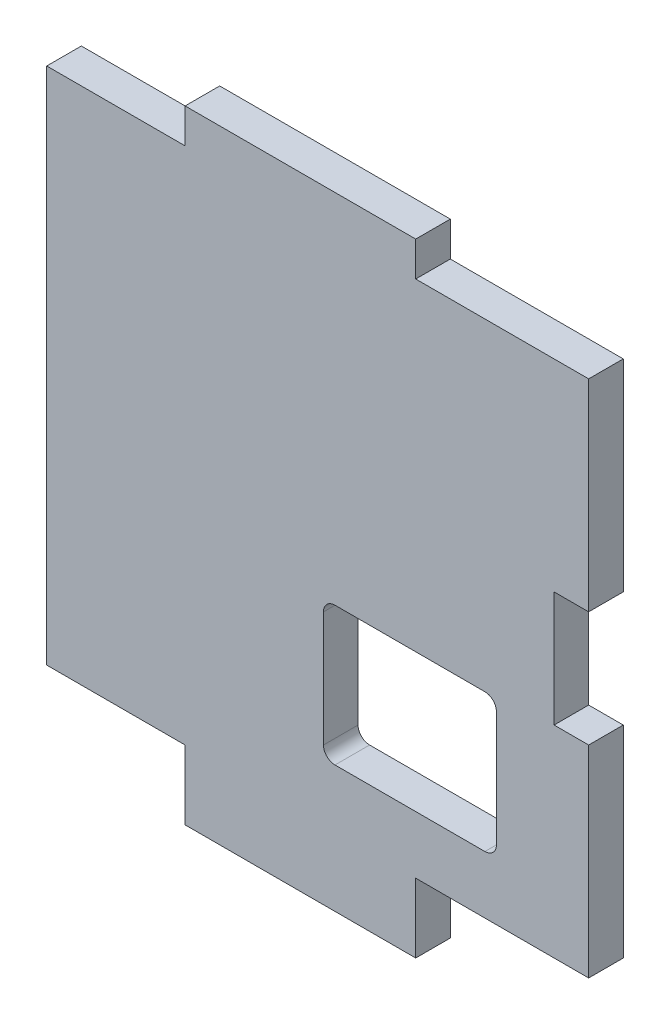
ISO-10303-21;
HEADER;
FILE_DESCRIPTION(('STEP AP214'),'2;1');
FILE_NAME('part.step','',(''),(''),'','','');
FILE_SCHEMA(('AUTOMOTIVE_DESIGN { 1 0 10303 214 1 1 1 1 }'));
ENDSEC;
DATA;
#1=APPLICATION_CONTEXT('core data for automotive mechanical design processes');
#2=APPLICATION_PROTOCOL_DEFINITION('international standard','automotive_design',2000,#1);
#3=PRODUCT_CONTEXT('',#1,'mechanical');
#4=PRODUCT('Part','Part','',(#3));
#5=PRODUCT_RELATED_PRODUCT_CATEGORY('part','',(#4));
#6=PRODUCT_DEFINITION_FORMATION('','',#4);
#7=PRODUCT_DEFINITION_CONTEXT('part definition',#1,'design');
#8=PRODUCT_DEFINITION('design','',#6,#7);
#9=PRODUCT_DEFINITION_SHAPE('','',#8);
#10=(LENGTH_UNIT() NAMED_UNIT(*) SI_UNIT(.MILLI.,.METRE.));
#11=(NAMED_UNIT(*) PLANE_ANGLE_UNIT() SI_UNIT($,.RADIAN.));
#12=(NAMED_UNIT(*) SI_UNIT($,.STERADIAN.) SOLID_ANGLE_UNIT());
#13=UNCERTAINTY_MEASURE_WITH_UNIT(LENGTH_MEASURE(1.E-05),#10,'distance_accuracy_value','');
#14=(GEOMETRIC_REPRESENTATION_CONTEXT(3) GLOBAL_UNCERTAINTY_ASSIGNED_CONTEXT((#13)) GLOBAL_UNIT_ASSIGNED_CONTEXT((#10,
#11,#12)) REPRESENTATION_CONTEXT('',''));
#15=CARTESIAN_POINT('',(0.,0.,0.));
#16=DIRECTION('',(0.,0.,1.));
#17=DIRECTION('',(1.,0.,0.));
#18=AXIS2_PLACEMENT_3D('',#15,#16,#17);
#19=CARTESIAN_POINT('',(12.,0.,3.));
#20=DIRECTION('',(0.,1.,0.));
#21=DIRECTION('',(-1.,0.,0.));
#22=AXIS2_PLACEMENT_3D('',#19,#20,#21);
#23=PLANE('',#22);
#24=DIRECTION('',(1.,0.,0.));
#25=VECTOR('',#24,1.);
#26=CARTESIAN_POINT('',(12.,0.,0.));
#27=LINE('',#26,#25);
#28=CARTESIAN_POINT('',(0.,0.,0.));
#29=VERTEX_POINT('',#28);
#30=CARTESIAN_POINT('',(12.,0.,0.));
#31=VERTEX_POINT('',#30);
#32=EDGE_CURVE('E217',#29,#31,#27,.T.);
#33=ORIENTED_EDGE('',*,*,#32,.T.);
#34=DIRECTION('',(0.,0.,-1.));
#35=VECTOR('',#34,1.);
#36=CARTESIAN_POINT('',(12.,0.,3.));
#37=LINE('',#36,#35);
#38=CARTESIAN_POINT('',(12.,0.,3.));
#39=VERTEX_POINT('',#38);
#40=EDGE_CURVE('E198',#39,#31,#37,.T.);
#41=ORIENTED_EDGE('',*,*,#40,.F.);
#42=DIRECTION('',(1.,0.,0.));
#43=VECTOR('',#42,1.);
#44=CARTESIAN_POINT('',(12.,0.,3.));
#45=LINE('',#44,#43);
#46=CARTESIAN_POINT('',(0.,0.,3.));
#47=VERTEX_POINT('',#46);
#48=EDGE_CURVE('E205',#47,#39,#45,.T.);
#49=ORIENTED_EDGE('',*,*,#48,.F.);
#50=DIRECTION('',(0.,0.,-1.));
#51=VECTOR('',#50,1.);
#52=CARTESIAN_POINT('',(0.,0.,3.));
#53=LINE('',#52,#51);
#54=EDGE_CURVE('E315',#47,#29,#53,.T.);
#55=ORIENTED_EDGE('',*,*,#54,.T.);
#56=EDGE_LOOP('',(#33,#41,#49,#55));
#57=FACE_BOUND('',#56,.T.);
#58=ADVANCED_FACE('F32',(#57),#23,.F.);
#59=CARTESIAN_POINT('',(12.,-6.,3.));
#60=DIRECTION('',(1.,0.,0.));
#61=DIRECTION('',(0.,1.,0.));
#62=AXIS2_PLACEMENT_3D('',#59,#60,#61);
#63=PLANE('',#62);
#64=DIRECTION('',(0.,-1.,0.));
#65=VECTOR('',#64,1.);
#66=CARTESIAN_POINT('',(12.,-6.,0.));
#67=LINE('',#66,#65);
#68=CARTESIAN_POINT('',(12.,-6.,0.));
#69=VERTEX_POINT('',#68);
#70=EDGE_CURVE('E317',#31,#69,#67,.T.);
#71=ORIENTED_EDGE('',*,*,#70,.T.);
#72=DIRECTION('',(0.,0.,-1.));
#73=VECTOR('',#72,1.);
#74=CARTESIAN_POINT('',(12.,-6.,3.));
#75=LINE('',#74,#73);
#76=CARTESIAN_POINT('',(12.,-6.,3.));
#77=VERTEX_POINT('',#76);
#78=EDGE_CURVE('E201',#77,#69,#75,.T.);
#79=ORIENTED_EDGE('',*,*,#78,.F.);
#80=DIRECTION('',(0.,-1.,0.));
#81=VECTOR('',#80,1.);
#82=CARTESIAN_POINT('',(12.,-6.,3.));
#83=LINE('',#82,#81);
#84=EDGE_CURVE('E194',#39,#77,#83,.T.);
#85=ORIENTED_EDGE('',*,*,#84,.F.);
#86=ORIENTED_EDGE('',*,*,#40,.T.);
#87=EDGE_LOOP('',(#71,#79,#85,#86));
#88=FACE_BOUND('',#87,.T.);
#89=ADVANCED_FACE('F196',(#88),#63,.F.);
#90=CARTESIAN_POINT('',(32.,-6.,3.));
#91=DIRECTION('',(0.,1.,0.));
#92=DIRECTION('',(-1.,0.,0.));
#93=AXIS2_PLACEMENT_3D('',#90,#91,#92);
#94=PLANE('',#93);
#95=DIRECTION('',(1.,0.,0.));
#96=VECTOR('',#95,1.);
#97=CARTESIAN_POINT('',(32.,-6.,0.));
#98=LINE('',#97,#96);
#99=CARTESIAN_POINT('',(32.,-6.,0.));
#100=VERTEX_POINT('',#99);
#101=EDGE_CURVE('E319',#69,#100,#98,.T.);
#102=ORIENTED_EDGE('',*,*,#101,.T.);
#103=DIRECTION('',(0.,0.,-1.));
#104=VECTOR('',#103,1.);
#105=CARTESIAN_POINT('',(32.,-6.,3.));
#106=LINE('',#105,#104);
#107=CARTESIAN_POINT('',(32.,-6.,3.));
#108=VERTEX_POINT('',#107);
#109=EDGE_CURVE('E222',#108,#100,#106,.T.);
#110=ORIENTED_EDGE('',*,*,#109,.F.);
#111=DIRECTION('',(1.,0.,0.));
#112=VECTOR('',#111,1.);
#113=CARTESIAN_POINT('',(32.,-6.,3.));
#114=LINE('',#113,#112);
#115=EDGE_CURVE('E204',#77,#108,#114,.T.);
#116=ORIENTED_EDGE('',*,*,#115,.F.);
#117=ORIENTED_EDGE('',*,*,#78,.T.);
#118=EDGE_LOOP('',(#102,#110,#116,#117));
#119=FACE_BOUND('',#118,.T.);
#120=ADVANCED_FACE('F404',(#119),#94,.F.);
#121=CARTESIAN_POINT('',(32.,0.,3.));
#122=DIRECTION('',(-1.,0.,0.));
#123=DIRECTION('',(0.,0.,1.));
#124=AXIS2_PLACEMENT_3D('',#121,#122,#123);
#125=PLANE('',#124);
#126=DIRECTION('',(0.,1.,0.));
#127=VECTOR('',#126,1.);
#128=CARTESIAN_POINT('',(32.,0.,0.));
#129=LINE('',#128,#127);
#130=CARTESIAN_POINT('',(32.,0.,0.));
#131=VERTEX_POINT('',#130);
#132=EDGE_CURVE('E321',#100,#131,#129,.T.);
#133=ORIENTED_EDGE('',*,*,#132,.T.);
#134=DIRECTION('',(0.,0.,-1.));
#135=VECTOR('',#134,1.);
#136=CARTESIAN_POINT('',(32.,0.,3.));
#137=LINE('',#136,#135);
#138=CARTESIAN_POINT('',(32.,0.,3.));
#139=VERTEX_POINT('',#138);
#140=EDGE_CURVE('E380',#139,#131,#137,.T.);
#141=ORIENTED_EDGE('',*,*,#140,.F.);
#142=DIRECTION('',(0.,1.,0.));
#143=VECTOR('',#142,1.);
#144=CARTESIAN_POINT('',(32.,0.,3.));
#145=LINE('',#144,#143);
#146=EDGE_CURVE('E290',#108,#139,#145,.T.);
#147=ORIENTED_EDGE('',*,*,#146,.F.);
#148=ORIENTED_EDGE('',*,*,#109,.T.);
#149=EDGE_LOOP('',(#133,#141,#147,#148));
#150=FACE_BOUND('',#149,.T.);
#151=ADVANCED_FACE('F387',(#150),#125,.F.);
#152=CARTESIAN_POINT('',(47.,0.,3.));
#153=DIRECTION('',(0.,1.,0.));
#154=DIRECTION('',(0.,0.,1.));
#155=AXIS2_PLACEMENT_3D('',#152,#153,#154);
#156=PLANE('',#155);
#157=DIRECTION('',(1.,0.,0.));
#158=VECTOR('',#157,1.);
#159=CARTESIAN_POINT('',(47.,0.,0.));
#160=LINE('',#159,#158);
#161=CARTESIAN_POINT('',(47.,0.,0.));
#162=VERTEX_POINT('',#161);
#163=EDGE_CURVE('E323',#131,#162,#160,.T.);
#164=ORIENTED_EDGE('',*,*,#163,.T.);
#165=DIRECTION('',(0.,0.,-1.));
#166=VECTOR('',#165,1.);
#167=CARTESIAN_POINT('',(47.,0.,3.));
#168=LINE('',#167,#166);
#169=CARTESIAN_POINT('',(47.,0.,3.));
#170=VERTEX_POINT('',#169);
#171=EDGE_CURVE('E377',#170,#162,#168,.T.);
#172=ORIENTED_EDGE('',*,*,#171,.F.);
#173=DIRECTION('',(1.,0.,0.));
#174=VECTOR('',#173,1.);
#175=CARTESIAN_POINT('',(47.,0.,3.));
#176=LINE('',#175,#174);
#177=EDGE_CURVE('E292',#139,#170,#176,.T.);
#178=ORIENTED_EDGE('',*,*,#177,.F.);
#179=ORIENTED_EDGE('',*,*,#140,.T.);
#180=EDGE_LOOP('',(#164,#172,#178,#179));
#181=FACE_BOUND('',#180,.T.);
#182=ADVANCED_FACE('F396',(#181),#156,.F.);
#183=CARTESIAN_POINT('',(47.,17.5,3.));
#184=DIRECTION('',(-1.,0.,0.));
#185=DIRECTION('',(0.,0.,1.));
#186=AXIS2_PLACEMENT_3D('',#183,#184,#185);
#187=PLANE('',#186);
#188=DIRECTION('',(0.,1.,0.));
#189=VECTOR('',#188,1.);
#190=CARTESIAN_POINT('',(47.,17.5,0.));
#191=LINE('',#190,#189);
#192=CARTESIAN_POINT('',(47.,17.5,0.));
#193=VERTEX_POINT('',#192);
#194=EDGE_CURVE('E325',#162,#193,#191,.T.);
#195=ORIENTED_EDGE('',*,*,#194,.T.);
#196=DIRECTION('',(0.,0.,-1.));
#197=VECTOR('',#196,1.);
#198=CARTESIAN_POINT('',(47.,17.5,3.));
#199=LINE('',#198,#197);
#200=CARTESIAN_POINT('',(47.,17.5,3.));
#201=VERTEX_POINT('',#200);
#202=EDGE_CURVE('E374',#201,#193,#199,.T.);
#203=ORIENTED_EDGE('',*,*,#202,.F.);
#204=DIRECTION('',(0.,1.,0.));
#205=VECTOR('',#204,1.);
#206=CARTESIAN_POINT('',(47.,17.5,3.));
#207=LINE('',#206,#205);
#208=EDGE_CURVE('E294',#170,#201,#207,.T.);
#209=ORIENTED_EDGE('',*,*,#208,.F.);
#210=ORIENTED_EDGE('',*,*,#171,.T.);
#211=EDGE_LOOP('',(#195,#203,#209,#210));
#212=FACE_BOUND('',#211,.T.);
#213=ADVANCED_FACE('F400',(#212),#187,.F.);
#214=CARTESIAN_POINT('',(44.,17.5,3.));
#215=DIRECTION('',(0.,-1.,0.));
#216=DIRECTION('',(0.,0.,-1.));
#217=AXIS2_PLACEMENT_3D('',#214,#215,#216);
#218=PLANE('',#217);
#219=DIRECTION('',(-1.,0.,0.));
#220=VECTOR('',#219,1.);
#221=CARTESIAN_POINT('',(44.,17.5,0.));
#222=LINE('',#221,#220);
#223=CARTESIAN_POINT('',(44.,17.5,0.));
#224=VERTEX_POINT('',#223);
#225=EDGE_CURVE('E327',#193,#224,#222,.T.);
#226=ORIENTED_EDGE('',*,*,#225,.T.);
#227=DIRECTION('',(0.,0.,-1.));
#228=VECTOR('',#227,1.);
#229=CARTESIAN_POINT('',(44.,17.5,3.));
#230=LINE('',#229,#228);
#231=CARTESIAN_POINT('',(44.,17.5,3.));
#232=VERTEX_POINT('',#231);
#233=EDGE_CURVE('E371',#232,#224,#230,.T.);
#234=ORIENTED_EDGE('',*,*,#233,.F.);
#235=DIRECTION('',(-1.,0.,0.));
#236=VECTOR('',#235,1.);
#237=CARTESIAN_POINT('',(44.,17.5,3.));
#238=LINE('',#237,#236);
#239=EDGE_CURVE('E296',#201,#232,#238,.T.);
#240=ORIENTED_EDGE('',*,*,#239,.F.);
#241=ORIENTED_EDGE('',*,*,#202,.T.);
#242=EDGE_LOOP('',(#226,#234,#240,#241));
#243=FACE_BOUND('',#242,.T.);
#244=ADVANCED_FACE('F494',(#243),#218,.F.);
#245=CARTESIAN_POINT('',(44.,27.5,3.));
#246=DIRECTION('',(-1.,0.,0.));
#247=DIRECTION('',(0.,0.,1.));
#248=AXIS2_PLACEMENT_3D('',#245,#246,#247);
#249=PLANE('',#248);
#250=DIRECTION('',(0.,1.,0.));
#251=VECTOR('',#250,1.);
#252=CARTESIAN_POINT('',(44.,27.5,0.));
#253=LINE('',#252,#251);
#254=CARTESIAN_POINT('',(44.,27.5,0.));
#255=VERTEX_POINT('',#254);
#256=EDGE_CURVE('E329',#224,#255,#253,.T.);
#257=ORIENTED_EDGE('',*,*,#256,.T.);
#258=DIRECTION('',(0.,0.,-1.));
#259=VECTOR('',#258,1.);
#260=CARTESIAN_POINT('',(44.,27.5,3.));
#261=LINE('',#260,#259);
#262=CARTESIAN_POINT('',(44.,27.5,3.));
#263=VERTEX_POINT('',#262);
#264=EDGE_CURVE('E368',#263,#255,#261,.T.);
#265=ORIENTED_EDGE('',*,*,#264,.F.);
#266=DIRECTION('',(0.,1.,0.));
#267=VECTOR('',#266,1.);
#268=CARTESIAN_POINT('',(44.,27.5,3.));
#269=LINE('',#268,#267);
#270=EDGE_CURVE('E298',#232,#263,#269,.T.);
#271=ORIENTED_EDGE('',*,*,#270,.F.);
#272=ORIENTED_EDGE('',*,*,#233,.T.);
#273=EDGE_LOOP('',(#257,#265,#271,#272));
#274=FACE_BOUND('',#273,.T.);
#275=ADVANCED_FACE('F490',(#274),#249,.F.);
#276=CARTESIAN_POINT('',(47.,27.5,3.));
#277=DIRECTION('',(0.,1.,0.));
#278=DIRECTION('',(-1.,0.,0.));
#279=AXIS2_PLACEMENT_3D('',#276,#277,#278);
#280=PLANE('',#279);
#281=DIRECTION('',(1.,0.,0.));
#282=VECTOR('',#281,1.);
#283=CARTESIAN_POINT('',(47.,27.5,0.));
#284=LINE('',#283,#282);
#285=CARTESIAN_POINT('',(47.,27.5,0.));
#286=VERTEX_POINT('',#285);
#287=EDGE_CURVE('E331',#255,#286,#284,.T.);
#288=ORIENTED_EDGE('',*,*,#287,.T.);
#289=DIRECTION('',(0.,0.,-1.));
#290=VECTOR('',#289,1.);
#291=CARTESIAN_POINT('',(47.,27.5,3.));
#292=LINE('',#291,#290);
#293=CARTESIAN_POINT('',(47.,27.5,3.));
#294=VERTEX_POINT('',#293);
#295=EDGE_CURVE('E365',#294,#286,#292,.T.);
#296=ORIENTED_EDGE('',*,*,#295,.F.);
#297=DIRECTION('',(1.,0.,0.));
#298=VECTOR('',#297,1.);
#299=CARTESIAN_POINT('',(47.,27.5,3.));
#300=LINE('',#299,#298);
#301=EDGE_CURVE('E300',#263,#294,#300,.T.);
#302=ORIENTED_EDGE('',*,*,#301,.F.);
#303=ORIENTED_EDGE('',*,*,#264,.T.);
#304=EDGE_LOOP('',(#288,#296,#302,#303));
#305=FACE_BOUND('',#304,.T.);
#306=ADVANCED_FACE('F486',(#305),#280,.F.);
#307=CARTESIAN_POINT('',(47.,45.,3.));
#308=DIRECTION('',(-1.,0.,0.));
#309=DIRECTION('',(0.,0.,1.));
#310=AXIS2_PLACEMENT_3D('',#307,#308,#309);
#311=PLANE('',#310);
#312=DIRECTION('',(0.,1.,0.));
#313=VECTOR('',#312,1.);
#314=CARTESIAN_POINT('',(47.,45.,0.));
#315=LINE('',#314,#313);
#316=CARTESIAN_POINT('',(47.,45.,0.));
#317=VERTEX_POINT('',#316);
#318=EDGE_CURVE('E333',#286,#317,#315,.T.);
#319=ORIENTED_EDGE('',*,*,#318,.T.);
#320=DIRECTION('',(0.,0.,-1.));
#321=VECTOR('',#320,1.);
#322=CARTESIAN_POINT('',(47.,45.,3.));
#323=LINE('',#322,#321);
#324=CARTESIAN_POINT('',(47.,45.,3.));
#325=VERTEX_POINT('',#324);
#326=EDGE_CURVE('E362',#325,#317,#323,.T.);
#327=ORIENTED_EDGE('',*,*,#326,.F.);
#328=DIRECTION('',(0.,1.,0.));
#329=VECTOR('',#328,1.);
#330=CARTESIAN_POINT('',(47.,45.,3.));
#331=LINE('',#330,#329);
#332=EDGE_CURVE('E302',#294,#325,#331,.T.);
#333=ORIENTED_EDGE('',*,*,#332,.F.);
#334=ORIENTED_EDGE('',*,*,#295,.T.);
#335=EDGE_LOOP('',(#319,#327,#333,#334));
#336=FACE_BOUND('',#335,.T.);
#337=ADVANCED_FACE('F482',(#336),#311,.F.);
#338=CARTESIAN_POINT('',(32.,45.,3.));
#339=DIRECTION('',(0.,-1.,0.));
#340=DIRECTION('',(0.,0.,-1.));
#341=AXIS2_PLACEMENT_3D('',#338,#339,#340);
#342=PLANE('',#341);
#343=DIRECTION('',(-1.,0.,0.));
#344=VECTOR('',#343,1.);
#345=CARTESIAN_POINT('',(32.,45.,0.));
#346=LINE('',#345,#344);
#347=CARTESIAN_POINT('',(32.,45.,0.));
#348=VERTEX_POINT('',#347);
#349=EDGE_CURVE('E335',#317,#348,#346,.T.);
#350=ORIENTED_EDGE('',*,*,#349,.T.);
#351=DIRECTION('',(0.,0.,-1.));
#352=VECTOR('',#351,1.);
#353=CARTESIAN_POINT('',(32.,45.,3.));
#354=LINE('',#353,#352);
#355=CARTESIAN_POINT('',(32.,45.,3.));
#356=VERTEX_POINT('',#355);
#357=EDGE_CURVE('E359',#356,#348,#354,.T.);
#358=ORIENTED_EDGE('',*,*,#357,.F.);
#359=DIRECTION('',(-1.,0.,0.));
#360=VECTOR('',#359,1.);
#361=CARTESIAN_POINT('',(32.,45.,3.));
#362=LINE('',#361,#360);
#363=EDGE_CURVE('E304',#325,#356,#362,.T.);
#364=ORIENTED_EDGE('',*,*,#363,.F.);
#365=ORIENTED_EDGE('',*,*,#326,.T.);
#366=EDGE_LOOP('',(#350,#358,#364,#365));
#367=FACE_BOUND('',#366,.T.);
#368=ADVANCED_FACE('F478',(#367),#342,.F.);
#369=CARTESIAN_POINT('',(32.,48.,3.));
#370=DIRECTION('',(-1.,0.,0.));
#371=DIRECTION('',(0.,0.,1.));
#372=AXIS2_PLACEMENT_3D('',#369,#370,#371);
#373=PLANE('',#372);
#374=DIRECTION('',(0.,1.,0.));
#375=VECTOR('',#374,1.);
#376=CARTESIAN_POINT('',(32.,48.,0.));
#377=LINE('',#376,#375);
#378=CARTESIAN_POINT('',(32.,48.,0.));
#379=VERTEX_POINT('',#378);
#380=EDGE_CURVE('E337',#348,#379,#377,.T.);
#381=ORIENTED_EDGE('',*,*,#380,.T.);
#382=DIRECTION('',(0.,0.,-1.));
#383=VECTOR('',#382,1.);
#384=CARTESIAN_POINT('',(32.,48.,3.));
#385=LINE('',#384,#383);
#386=CARTESIAN_POINT('',(32.,48.,3.));
#387=VERTEX_POINT('',#386);
#388=EDGE_CURVE('E356',#387,#379,#385,.T.);
#389=ORIENTED_EDGE('',*,*,#388,.F.);
#390=DIRECTION('',(0.,1.,0.));
#391=VECTOR('',#390,1.);
#392=CARTESIAN_POINT('',(32.,48.,3.));
#393=LINE('',#392,#391);
#394=EDGE_CURVE('E306',#356,#387,#393,.T.);
#395=ORIENTED_EDGE('',*,*,#394,.F.);
#396=ORIENTED_EDGE('',*,*,#357,.T.);
#397=EDGE_LOOP('',(#381,#389,#395,#396));
#398=FACE_BOUND('',#397,.T.);
#399=ADVANCED_FACE('F474',(#398),#373,.F.);
#400=CARTESIAN_POINT('',(12.,48.,3.));
#401=DIRECTION('',(0.,-1.,0.));
#402=DIRECTION('',(0.,0.,-1.));
#403=AXIS2_PLACEMENT_3D('',#400,#401,#402);
#404=PLANE('',#403);
#405=DIRECTION('',(-1.,0.,0.));
#406=VECTOR('',#405,1.);
#407=CARTESIAN_POINT('',(12.,48.,0.));
#408=LINE('',#407,#406);
#409=CARTESIAN_POINT('',(12.,48.,0.));
#410=VERTEX_POINT('',#409);
#411=EDGE_CURVE('E339',#379,#410,#408,.T.);
#412=ORIENTED_EDGE('',*,*,#411,.T.);
#413=DIRECTION('',(0.,0.,-1.));
#414=VECTOR('',#413,1.);
#415=CARTESIAN_POINT('',(12.,48.,3.));
#416=LINE('',#415,#414);
#417=CARTESIAN_POINT('',(12.,48.,3.));
#418=VERTEX_POINT('',#417);
#419=EDGE_CURVE('E353',#418,#410,#416,.T.);
#420=ORIENTED_EDGE('',*,*,#419,.F.);
#421=DIRECTION('',(-1.,0.,0.));
#422=VECTOR('',#421,1.);
#423=CARTESIAN_POINT('',(12.,48.,3.));
#424=LINE('',#423,#422);
#425=EDGE_CURVE('E308',#387,#418,#424,.T.);
#426=ORIENTED_EDGE('',*,*,#425,.F.);
#427=ORIENTED_EDGE('',*,*,#388,.T.);
#428=EDGE_LOOP('',(#412,#420,#426,#427));
#429=FACE_BOUND('',#428,.T.);
#430=ADVANCED_FACE('F470',(#429),#404,.F.);
#431=CARTESIAN_POINT('',(12.,45.,3.));
#432=DIRECTION('',(1.,0.,0.));
#433=DIRECTION('',(0.,0.,-1.));
#434=AXIS2_PLACEMENT_3D('',#431,#432,#433);
#435=PLANE('',#434);
#436=DIRECTION('',(0.,-1.,0.));
#437=VECTOR('',#436,1.);
#438=CARTESIAN_POINT('',(12.,45.,0.));
#439=LINE('',#438,#437);
#440=CARTESIAN_POINT('',(12.,45.,0.));
#441=VERTEX_POINT('',#440);
#442=EDGE_CURVE('E341',#410,#441,#439,.T.);
#443=ORIENTED_EDGE('',*,*,#442,.T.);
#444=DIRECTION('',(0.,0.,-1.));
#445=VECTOR('',#444,1.);
#446=CARTESIAN_POINT('',(12.,45.,3.));
#447=LINE('',#446,#445);
#448=CARTESIAN_POINT('',(12.,45.,3.));
#449=VERTEX_POINT('',#448);
#450=EDGE_CURVE('E350',#449,#441,#447,.T.);
#451=ORIENTED_EDGE('',*,*,#450,.F.);
#452=DIRECTION('',(0.,-1.,0.));
#453=VECTOR('',#452,1.);
#454=CARTESIAN_POINT('',(12.,45.,3.));
#455=LINE('',#454,#453);
#456=EDGE_CURVE('E310',#418,#449,#455,.T.);
#457=ORIENTED_EDGE('',*,*,#456,.F.);
#458=ORIENTED_EDGE('',*,*,#419,.T.);
#459=EDGE_LOOP('',(#443,#451,#457,#458));
#460=FACE_BOUND('',#459,.T.);
#461=ADVANCED_FACE('F466',(#460),#435,.F.);
#462=CARTESIAN_POINT('',(0.,45.,3.));
#463=DIRECTION('',(0.,-1.,0.));
#464=DIRECTION('',(0.,0.,-1.));
#465=AXIS2_PLACEMENT_3D('',#462,#463,#464);
#466=PLANE('',#465);
#467=DIRECTION('',(-1.,0.,0.));
#468=VECTOR('',#467,1.);
#469=CARTESIAN_POINT('',(0.,45.,0.));
#470=LINE('',#469,#468);
#471=CARTESIAN_POINT('',(0.,45.,0.));
#472=VERTEX_POINT('',#471);
#473=EDGE_CURVE('E343',#441,#472,#470,.T.);
#474=ORIENTED_EDGE('',*,*,#473,.T.);
#475=DIRECTION('',(0.,0.,-1.));
#476=VECTOR('',#475,1.);
#477=CARTESIAN_POINT('',(0.,45.,3.));
#478=LINE('',#477,#476);
#479=CARTESIAN_POINT('',(0.,45.,3.));
#480=VERTEX_POINT('',#479);
#481=EDGE_CURVE('E347',#480,#472,#478,.T.);
#482=ORIENTED_EDGE('',*,*,#481,.F.);
#483=DIRECTION('',(-1.,0.,0.));
#484=VECTOR('',#483,1.);
#485=CARTESIAN_POINT('',(0.,45.,3.));
#486=LINE('',#485,#484);
#487=EDGE_CURVE('E312',#449,#480,#486,.T.);
#488=ORIENTED_EDGE('',*,*,#487,.F.);
#489=ORIENTED_EDGE('',*,*,#450,.T.);
#490=EDGE_LOOP('',(#474,#482,#488,#489));
#491=FACE_BOUND('',#490,.T.);
#492=ADVANCED_FACE('F462',(#491),#466,.F.);
#493=CARTESIAN_POINT('',(0.,0.,3.));
#494=DIRECTION('',(1.,0.,0.));
#495=DIRECTION('',(0.,0.,-1.));
#496=AXIS2_PLACEMENT_3D('',#493,#494,#495);
#497=PLANE('',#496);
#498=DIRECTION('',(0.,-1.,0.));
#499=VECTOR('',#498,1.);
#500=CARTESIAN_POINT('',(0.,0.,0.));
#501=LINE('',#500,#499);
#502=EDGE_CURVE('E214',#472,#29,#501,.T.);
#503=ORIENTED_EDGE('',*,*,#502,.T.);
#504=ORIENTED_EDGE('',*,*,#54,.F.);
#505=DIRECTION('',(0.,-1.,0.));
#506=VECTOR('',#505,1.);
#507=CARTESIAN_POINT('',(0.,0.,3.));
#508=LINE('',#507,#506);
#509=EDGE_CURVE('E210',#480,#47,#508,.T.);
#510=ORIENTED_EDGE('',*,*,#509,.F.);
#511=ORIENTED_EDGE('',*,*,#481,.T.);
#512=EDGE_LOOP('',(#503,#504,#510,#511));
#513=FACE_BOUND('',#512,.T.);
#514=ADVANCED_FACE('F457',(#513),#497,.F.);
#515=CARTESIAN_POINT('',(0.,0.,3.));
#516=DIRECTION('',(0.,0.,-1.));
#517=DIRECTION('',(-1.,0.,0.));
#518=AXIS2_PLACEMENT_3D('',#515,#516,#517);
#519=PLANE('',#518);
#520=DIRECTION('',(1.,0.,0.));
#521=VECTOR('',#520,1.);
#522=CARTESIAN_POINT('',(24.,5.,3.));
#523=LINE('',#522,#521);
#524=CARTESIAN_POINT('',(25.,5.,3.));
#525=VERTEX_POINT('',#524);
#526=CARTESIAN_POINT('',(38.,5.,3.));
#527=VERTEX_POINT('',#526);
#528=EDGE_CURVE('E257',#525,#527,#523,.T.);
#529=ORIENTED_EDGE('',*,*,#528,.F.);
#530=CARTESIAN_POINT('',(25.,6.,3.));
#531=DIRECTION('',(0.,0.,-1.));
#532=DIRECTION('',(-1.,0.,0.));
#533=AXIS2_PLACEMENT_3D('',#530,#531,#532);
#534=CIRCLE('',#533,1.);
#535=CARTESIAN_POINT('',(24.,6.,3.));
#536=VERTEX_POINT('',#535);
#537=EDGE_CURVE('E40',#525,#536,#534,.T.);
#538=ORIENTED_EDGE('',*,*,#537,.T.);
#539=DIRECTION('',(0.,-1.,0.));
#540=VECTOR('',#539,1.);
#541=CARTESIAN_POINT('',(24.,17.,3.));
#542=LINE('',#541,#540);
#543=CARTESIAN_POINT('',(24.,16.,3.));
#544=VERTEX_POINT('',#543);
#545=EDGE_CURVE('E255',#544,#536,#542,.T.);
#546=ORIENTED_EDGE('',*,*,#545,.F.);
#547=CARTESIAN_POINT('',(25.,16.,3.));
#548=DIRECTION('',(0.,0.,-1.));
#549=DIRECTION('',(-1.,0.,0.));
#550=AXIS2_PLACEMENT_3D('',#547,#548,#549);
#551=CIRCLE('',#550,1.);
#552=CARTESIAN_POINT('',(25.,17.,3.));
#553=VERTEX_POINT('',#552);
#554=EDGE_CURVE('E250',#544,#553,#551,.T.);
#555=ORIENTED_EDGE('',*,*,#554,.T.);
#556=DIRECTION('',(-1.,0.,0.));
#557=VECTOR('',#556,1.);
#558=CARTESIAN_POINT('',(24.,17.,3.));
#559=LINE('',#558,#557);
#560=CARTESIAN_POINT('',(38.,17.,3.));
#561=VERTEX_POINT('',#560);
#562=EDGE_CURVE('E279',#561,#553,#559,.T.);
#563=ORIENTED_EDGE('',*,*,#562,.F.);
#564=CARTESIAN_POINT('',(38.,16.,3.));
#565=DIRECTION('',(0.,0.,-1.));
#566=DIRECTION('',(-1.,0.,0.));
#567=AXIS2_PLACEMENT_3D('',#564,#565,#566);
#568=CIRCLE('',#567,1.);
#569=CARTESIAN_POINT('',(39.,16.,3.));
#570=VERTEX_POINT('',#569);
#571=EDGE_CURVE('E246',#561,#570,#568,.T.);
#572=ORIENTED_EDGE('',*,*,#571,.T.);
#573=DIRECTION('',(0.,1.,0.));
#574=VECTOR('',#573,1.);
#575=CARTESIAN_POINT('',(39.,17.,3.));
#576=LINE('',#575,#574);
#577=CARTESIAN_POINT('',(39.,6.,3.));
#578=VERTEX_POINT('',#577);
#579=EDGE_CURVE('E284',#578,#570,#576,.T.);
#580=ORIENTED_EDGE('',*,*,#579,.F.);
#581=CARTESIAN_POINT('',(38.,6.,3.));
#582=DIRECTION('',(0.,0.,-1.));
#583=DIRECTION('',(-1.,0.,0.));
#584=AXIS2_PLACEMENT_3D('',#581,#582,#583);
#585=CIRCLE('',#584,1.);
#586=EDGE_CURVE('E242',#578,#527,#585,.T.);
#587=ORIENTED_EDGE('',*,*,#586,.T.);
#588=EDGE_LOOP('',(#529,#538,#546,#555,#563,#572,#580,#587));
#589=FACE_BOUND('',#588,.T.);
#590=ORIENTED_EDGE('',*,*,#48,.T.);
#591=ORIENTED_EDGE('',*,*,#84,.T.);
#592=ORIENTED_EDGE('',*,*,#115,.T.);
#593=ORIENTED_EDGE('',*,*,#146,.T.);
#594=ORIENTED_EDGE('',*,*,#177,.T.);
#595=ORIENTED_EDGE('',*,*,#208,.T.);
#596=ORIENTED_EDGE('',*,*,#239,.T.);
#597=ORIENTED_EDGE('',*,*,#270,.T.);
#598=ORIENTED_EDGE('',*,*,#301,.T.);
#599=ORIENTED_EDGE('',*,*,#332,.T.);
#600=ORIENTED_EDGE('',*,*,#363,.T.);
#601=ORIENTED_EDGE('',*,*,#394,.T.);
#602=ORIENTED_EDGE('',*,*,#425,.T.);
#603=ORIENTED_EDGE('',*,*,#456,.T.);
#604=ORIENTED_EDGE('',*,*,#487,.T.);
#605=ORIENTED_EDGE('',*,*,#509,.T.);
#606=EDGE_LOOP('',(#590,#591,#592,#593,#594,#595,#596,#597,#598,#599,#600,#601,#602,#603,#604,#605));
#607=FACE_BOUND('',#606,.T.);
#608=ADVANCED_FACE('F208',(#589,#607),#519,.F.);
#609=CARTESIAN_POINT('',(0.,0.,0.));
#610=DIRECTION('',(0.,0.,-1.));
#611=DIRECTION('',(-1.,0.,0.));
#612=AXIS2_PLACEMENT_3D('',#609,#610,#611);
#613=PLANE('',#612);
#614=DIRECTION('',(-1.,0.,0.));
#615=VECTOR('',#614,1.);
#616=CARTESIAN_POINT('',(24.,17.,0.));
#617=LINE('',#616,#615);
#618=CARTESIAN_POINT('',(38.,17.,0.));
#619=VERTEX_POINT('',#618);
#620=CARTESIAN_POINT('',(25.,17.,0.));
#621=VERTEX_POINT('',#620);
#622=EDGE_CURVE('E277',#619,#621,#617,.T.);
#623=ORIENTED_EDGE('',*,*,#622,.T.);
#624=CARTESIAN_POINT('',(25.,16.,0.));
#625=DIRECTION('',(0.,0.,-1.));
#626=DIRECTION('',(-1.,0.,0.));
#627=AXIS2_PLACEMENT_3D('',#624,#625,#626);
#628=CIRCLE('',#627,1.);
#629=CARTESIAN_POINT('',(24.,16.,0.));
#630=VERTEX_POINT('',#629);
#631=EDGE_CURVE('E54',#621,#630,#628,.F.);
#632=ORIENTED_EDGE('',*,*,#631,.T.);
#633=DIRECTION('',(0.,-1.,0.));
#634=VECTOR('',#633,1.);
#635=CARTESIAN_POINT('',(24.,17.,0.));
#636=LINE('',#635,#634);
#637=CARTESIAN_POINT('',(24.,6.,0.));
#638=VERTEX_POINT('',#637);
#639=EDGE_CURVE('E270',#630,#638,#636,.T.);
#640=ORIENTED_EDGE('',*,*,#639,.T.);
#641=CARTESIAN_POINT('',(25.,6.,0.));
#642=DIRECTION('',(0.,0.,-1.));
#643=DIRECTION('',(-1.,0.,0.));
#644=AXIS2_PLACEMENT_3D('',#641,#642,#643);
#645=CIRCLE('',#644,1.);
#646=CARTESIAN_POINT('',(25.,5.,0.));
#647=VERTEX_POINT('',#646);
#648=EDGE_CURVE('E11',#638,#647,#645,.F.);
#649=ORIENTED_EDGE('',*,*,#648,.T.);
#650=DIRECTION('',(1.,0.,0.));
#651=VECTOR('',#650,1.);
#652=CARTESIAN_POINT('',(24.,5.,0.));
#653=LINE('',#652,#651);
#654=CARTESIAN_POINT('',(38.,5.,0.));
#655=VERTEX_POINT('',#654);
#656=EDGE_CURVE('E268',#647,#655,#653,.T.);
#657=ORIENTED_EDGE('',*,*,#656,.T.);
#658=CARTESIAN_POINT('',(38.,6.,0.));
#659=DIRECTION('',(0.,0.,-1.));
#660=DIRECTION('',(-1.,0.,0.));
#661=AXIS2_PLACEMENT_3D('',#658,#659,#660);
#662=CIRCLE('',#661,1.);
#663=CARTESIAN_POINT('',(39.,6.,0.));
#664=VERTEX_POINT('',#663);
#665=EDGE_CURVE('E244',#655,#664,#662,.F.);
#666=ORIENTED_EDGE('',*,*,#665,.T.);
#667=DIRECTION('',(0.,1.,0.));
#668=VECTOR('',#667,1.);
#669=CARTESIAN_POINT('',(39.,17.,0.));
#670=LINE('',#669,#668);
#671=CARTESIAN_POINT('',(39.,16.,0.));
#672=VERTEX_POINT('',#671);
#673=EDGE_CURVE('E274',#664,#672,#670,.T.);
#674=ORIENTED_EDGE('',*,*,#673,.T.);
#675=CARTESIAN_POINT('',(38.,16.,0.));
#676=DIRECTION('',(0.,0.,-1.));
#677=DIRECTION('',(-1.,0.,0.));
#678=AXIS2_PLACEMENT_3D('',#675,#676,#677);
#679=CIRCLE('',#678,1.);
#680=EDGE_CURVE('E248',#672,#619,#679,.F.);
#681=ORIENTED_EDGE('',*,*,#680,.T.);
#682=EDGE_LOOP('',(#623,#632,#640,#649,#657,#666,#674,#681));
#683=FACE_BOUND('',#682,.T.);
#684=ORIENTED_EDGE('',*,*,#32,.F.);
#685=ORIENTED_EDGE('',*,*,#502,.F.);
#686=ORIENTED_EDGE('',*,*,#473,.F.);
#687=ORIENTED_EDGE('',*,*,#442,.F.);
#688=ORIENTED_EDGE('',*,*,#411,.F.);
#689=ORIENTED_EDGE('',*,*,#380,.F.);
#690=ORIENTED_EDGE('',*,*,#349,.F.);
#691=ORIENTED_EDGE('',*,*,#318,.F.);
#692=ORIENTED_EDGE('',*,*,#287,.F.);
#693=ORIENTED_EDGE('',*,*,#256,.F.);
#694=ORIENTED_EDGE('',*,*,#225,.F.);
#695=ORIENTED_EDGE('',*,*,#194,.F.);
#696=ORIENTED_EDGE('',*,*,#163,.F.);
#697=ORIENTED_EDGE('',*,*,#132,.F.);
#698=ORIENTED_EDGE('',*,*,#101,.F.);
#699=ORIENTED_EDGE('',*,*,#70,.F.);
#700=EDGE_LOOP('',(#684,#685,#686,#687,#688,#689,#690,#691,#692,#693,#694,#695,#696,#697,#698,#699));
#701=FACE_BOUND('',#700,.T.);
#702=ADVANCED_FACE('F266',(#683,#701),#613,.T.);
#703=CARTESIAN_POINT('',(24.,17.,0.));
#704=DIRECTION('',(-1.,0.,0.));
#705=DIRECTION('',(0.,-1.,0.));
#706=AXIS2_PLACEMENT_3D('',#703,#704,#705);
#707=PLANE('',#706);
#708=ORIENTED_EDGE('',*,*,#639,.F.);
#709=DIRECTION('',(0.,0.,1.));
#710=VECTOR('',#709,1.);
#711=CARTESIAN_POINT('',(24.,16.,3.));
#712=LINE('',#711,#710);
#713=EDGE_CURVE('E239',#630,#544,#712,.T.);
#714=ORIENTED_EDGE('',*,*,#713,.T.);
#715=ORIENTED_EDGE('',*,*,#545,.T.);
#716=DIRECTION('',(0.,0.,1.));
#717=VECTOR('',#716,1.);
#718=CARTESIAN_POINT('',(24.,6.,0.));
#719=LINE('',#718,#717);
#720=EDGE_CURVE('E47',#536,#638,#719,.F.);
#721=ORIENTED_EDGE('',*,*,#720,.T.);
#722=EDGE_LOOP('',(#708,#714,#715,#721));
#723=FACE_BOUND('',#722,.T.);
#724=ADVANCED_FACE('F260',(#723),#707,.F.);
#725=CARTESIAN_POINT('',(24.,17.,0.));
#726=DIRECTION('',(0.,1.,0.));
#727=DIRECTION('',(0.,0.,1.));
#728=AXIS2_PLACEMENT_3D('',#725,#726,#727);
#729=PLANE('',#728);
#730=ORIENTED_EDGE('',*,*,#622,.F.);
#731=DIRECTION('',(0.,0.,1.));
#732=VECTOR('',#731,1.);
#733=CARTESIAN_POINT('',(38.,17.,3.));
#734=LINE('',#733,#732);
#735=EDGE_CURVE('E235',#619,#561,#734,.T.);
#736=ORIENTED_EDGE('',*,*,#735,.T.);
#737=ORIENTED_EDGE('',*,*,#562,.T.);
#738=DIRECTION('',(0.,0.,1.));
#739=VECTOR('',#738,1.);
#740=CARTESIAN_POINT('',(25.,17.,0.));
#741=LINE('',#740,#739);
#742=EDGE_CURVE('E233',#553,#621,#741,.F.);
#743=ORIENTED_EDGE('',*,*,#742,.T.);
#744=EDGE_LOOP('',(#730,#736,#737,#743));
#745=FACE_BOUND('',#744,.T.);
#746=ADVANCED_FACE('F435',(#745),#729,.F.);
#747=CARTESIAN_POINT('',(39.,17.,0.));
#748=DIRECTION('',(1.,0.,0.));
#749=DIRECTION('',(0.,0.,-1.));
#750=AXIS2_PLACEMENT_3D('',#747,#748,#749);
#751=PLANE('',#750);
#752=ORIENTED_EDGE('',*,*,#673,.F.);
#753=DIRECTION('',(0.,0.,1.));
#754=VECTOR('',#753,1.);
#755=CARTESIAN_POINT('',(39.,6.,3.));
#756=LINE('',#755,#754);
#757=EDGE_CURVE('E220',#664,#578,#756,.T.);
#758=ORIENTED_EDGE('',*,*,#757,.T.);
#759=ORIENTED_EDGE('',*,*,#579,.T.);
#760=DIRECTION('',(0.,0.,1.));
#761=VECTOR('',#760,1.);
#762=CARTESIAN_POINT('',(39.,16.,0.));
#763=LINE('',#762,#761);
#764=EDGE_CURVE('E218',#570,#672,#763,.F.);
#765=ORIENTED_EDGE('',*,*,#764,.T.);
#766=EDGE_LOOP('',(#752,#758,#759,#765));
#767=FACE_BOUND('',#766,.T.);
#768=ADVANCED_FACE('F442',(#767),#751,.F.);
#769=CARTESIAN_POINT('',(24.,5.,0.));
#770=DIRECTION('',(0.,-1.,0.));
#771=DIRECTION('',(0.,0.,-1.));
#772=AXIS2_PLACEMENT_3D('',#769,#770,#771);
#773=PLANE('',#772);
#774=ORIENTED_EDGE('',*,*,#528,.T.);
#775=DIRECTION('',(0.,0.,1.));
#776=VECTOR('',#775,1.);
#777=CARTESIAN_POINT('',(38.,5.,0.));
#778=LINE('',#777,#776);
#779=EDGE_CURVE('E231',#527,#655,#778,.F.);
#780=ORIENTED_EDGE('',*,*,#779,.T.);
#781=ORIENTED_EDGE('',*,*,#656,.F.);
#782=DIRECTION('',(0.,0.,1.));
#783=VECTOR('',#782,1.);
#784=CARTESIAN_POINT('',(25.,5.,3.));
#785=LINE('',#784,#783);
#786=EDGE_CURVE('E228',#647,#525,#785,.T.);
#787=ORIENTED_EDGE('',*,*,#786,.T.);
#788=EDGE_LOOP('',(#774,#780,#781,#787));
#789=FACE_BOUND('',#788,.T.);
#790=ADVANCED_FACE('F272',(#789),#773,.F.);
#791=CARTESIAN_POINT('',(38.,6.,0.));
#792=DIRECTION('',(0.,0.,-1.));
#793=DIRECTION('',(-1.,0.,0.));
#794=AXIS2_PLACEMENT_3D('',#791,#792,#793);
#795=CYLINDRICAL_SURFACE('',#794,1.);
#796=ORIENTED_EDGE('',*,*,#665,.F.);
#797=ORIENTED_EDGE('',*,*,#779,.F.);
#798=ORIENTED_EDGE('',*,*,#586,.F.);
#799=ORIENTED_EDGE('',*,*,#757,.F.);
#800=EDGE_LOOP('',(#796,#797,#798,#799));
#801=FACE_BOUND('',#800,.T.);
#802=ADVANCED_FACE('F418',(#801),#795,.F.);
#803=CARTESIAN_POINT('',(38.,16.,0.));
#804=DIRECTION('',(0.,0.,-1.));
#805=DIRECTION('',(-1.,0.,0.));
#806=AXIS2_PLACEMENT_3D('',#803,#804,#805);
#807=CYLINDRICAL_SURFACE('',#806,1.);
#808=ORIENTED_EDGE('',*,*,#680,.F.);
#809=ORIENTED_EDGE('',*,*,#764,.F.);
#810=ORIENTED_EDGE('',*,*,#571,.F.);
#811=ORIENTED_EDGE('',*,*,#735,.F.);
#812=EDGE_LOOP('',(#808,#809,#810,#811));
#813=FACE_BOUND('',#812,.T.);
#814=ADVANCED_FACE('F421',(#813),#807,.F.);
#815=CARTESIAN_POINT('',(25.,16.,0.));
#816=DIRECTION('',(0.,0.,-1.));
#817=DIRECTION('',(-1.,0.,0.));
#818=AXIS2_PLACEMENT_3D('',#815,#816,#817);
#819=CYLINDRICAL_SURFACE('',#818,1.);
#820=ORIENTED_EDGE('',*,*,#631,.F.);
#821=ORIENTED_EDGE('',*,*,#742,.F.);
#822=ORIENTED_EDGE('',*,*,#554,.F.);
#823=ORIENTED_EDGE('',*,*,#713,.F.);
#824=EDGE_LOOP('',(#820,#821,#822,#823));
#825=FACE_BOUND('',#824,.T.);
#826=ADVANCED_FACE('F424',(#825),#819,.F.);
#827=CARTESIAN_POINT('',(25.,6.,0.));
#828=DIRECTION('',(0.,0.,-1.));
#829=DIRECTION('',(-1.,0.,0.));
#830=AXIS2_PLACEMENT_3D('',#827,#828,#829);
#831=CYLINDRICAL_SURFACE('',#830,1.);
#832=ORIENTED_EDGE('',*,*,#648,.F.);
#833=ORIENTED_EDGE('',*,*,#720,.F.);
#834=ORIENTED_EDGE('',*,*,#537,.F.);
#835=ORIENTED_EDGE('',*,*,#786,.F.);
#836=EDGE_LOOP('',(#832,#833,#834,#835));
#837=FACE_BOUND('',#836,.T.);
#838=ADVANCED_FACE('F34',(#837),#831,.F.);
#839=CLOSED_SHELL('',(#58,#89,#120,#151,#182,#213,#244,#275,#306,#337,#368,#399,#430,#461,#492,
#514,#608,#702,#724,#746,#768,#790,#802,#814,#826,#838));
#840=MANIFOLD_SOLID_BREP('B2',#839);
#841=ADVANCED_BREP_SHAPE_REPRESENTATION('',(#18,#840),#14);
#842=SHAPE_DEFINITION_REPRESENTATION(#9,#841);
ENDSEC;
END-ISO-10303-21;
